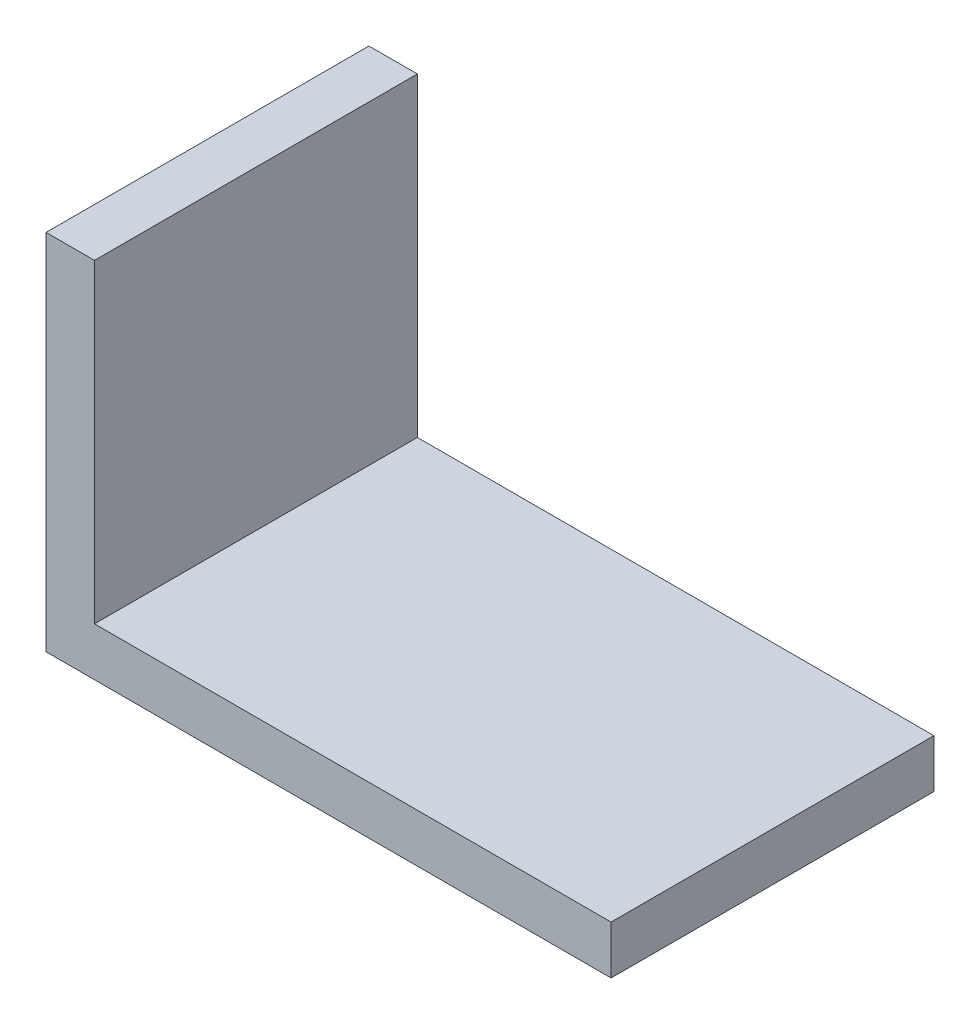
ISO-10303-21;
HEADER;
FILE_DESCRIPTION(('STEP AP214'),'2;1');
FILE_NAME('part.step','',(''),(''),'','','');
FILE_SCHEMA(('AUTOMOTIVE_DESIGN { 1 0 10303 214 1 1 1 1 }'));
ENDSEC;
DATA;
#1=APPLICATION_CONTEXT('core data for automotive mechanical design processes');
#2=APPLICATION_PROTOCOL_DEFINITION('international standard','automotive_design',2000,#1);
#3=PRODUCT_CONTEXT('',#1,'mechanical');
#4=PRODUCT('Part','Part','',(#3));
#5=PRODUCT_RELATED_PRODUCT_CATEGORY('part','',(#4));
#6=PRODUCT_DEFINITION_FORMATION('','',#4);
#7=PRODUCT_DEFINITION_CONTEXT('part definition',#1,'design');
#8=PRODUCT_DEFINITION('design','',#6,#7);
#9=PRODUCT_DEFINITION_SHAPE('','',#8);
#10=(LENGTH_UNIT() NAMED_UNIT(*) SI_UNIT(.MILLI.,.METRE.));
#11=(NAMED_UNIT(*) PLANE_ANGLE_UNIT() SI_UNIT($,.RADIAN.));
#12=(NAMED_UNIT(*) SI_UNIT($,.STERADIAN.) SOLID_ANGLE_UNIT());
#13=UNCERTAINTY_MEASURE_WITH_UNIT(LENGTH_MEASURE(1.E-05),#10,'distance_accuracy_value','');
#14=(GEOMETRIC_REPRESENTATION_CONTEXT(3) GLOBAL_UNCERTAINTY_ASSIGNED_CONTEXT((#13)) GLOBAL_UNIT_ASSIGNED_CONTEXT((#10,
#11,#12)) REPRESENTATION_CONTEXT('',''));
#15=CARTESIAN_POINT('',(0.,0.,0.));
#16=DIRECTION('',(0.,0.,1.));
#17=DIRECTION('',(1.,0.,0.));
#18=AXIS2_PLACEMENT_3D('',#15,#16,#17);
#19=CARTESIAN_POINT('',(0.,90.,40.));
#20=DIRECTION('',(1.,0.,0.));
#21=DIRECTION('',(0.,0.,-1.));
#22=AXIS2_PLACEMENT_3D('',#19,#20,#21);
#23=PLANE('',#22);
#24=DIRECTION('',(0.,-1.,0.));
#25=VECTOR('',#24,1.);
#26=CARTESIAN_POINT('',(0.,90.,-40.));
#27=LINE('',#26,#25);
#28=CARTESIAN_POINT('',(0.,90.,-40.));
#29=VERTEX_POINT('',#28);
#30=CARTESIAN_POINT('',(0.,0.,-40.));
#31=VERTEX_POINT('',#30);
#32=EDGE_CURVE('E125',#29,#31,#27,.T.);
#33=ORIENTED_EDGE('',*,*,#32,.T.);
#34=DIRECTION('',(0.,0.,-1.));
#35=VECTOR('',#34,1.);
#36=CARTESIAN_POINT('',(0.,0.,40.));
#37=LINE('',#36,#35);
#38=CARTESIAN_POINT('',(0.,0.,40.));
#39=VERTEX_POINT('',#38);
#40=EDGE_CURVE('E11',#39,#31,#37,.T.);
#41=ORIENTED_EDGE('',*,*,#40,.F.);
#42=DIRECTION('',(0.,-1.,0.));
#43=VECTOR('',#42,1.);
#44=CARTESIAN_POINT('',(0.,90.,40.));
#45=LINE('',#44,#43);
#46=CARTESIAN_POINT('',(0.,90.,40.));
#47=VERTEX_POINT('',#46);
#48=EDGE_CURVE('E135',#47,#39,#45,.T.);
#49=ORIENTED_EDGE('',*,*,#48,.F.);
#50=DIRECTION('',(0.,0.,-1.));
#51=VECTOR('',#50,1.);
#52=CARTESIAN_POINT('',(0.,90.,40.));
#53=LINE('',#52,#51);
#54=EDGE_CURVE('E121',#47,#29,#53,.T.);
#55=ORIENTED_EDGE('',*,*,#54,.T.);
#56=EDGE_LOOP('',(#33,#41,#49,#55));
#57=FACE_BOUND('',#56,.T.);
#58=ADVANCED_FACE('F41',(#57),#23,.F.);
#59=CARTESIAN_POINT('',(0.,0.,40.));
#60=DIRECTION('',(0.,1.,0.));
#61=DIRECTION('',(0.,0.,1.));
#62=AXIS2_PLACEMENT_3D('',#59,#60,#61);
#63=PLANE('',#62);
#64=DIRECTION('',(1.,0.,0.));
#65=VECTOR('',#64,1.);
#66=CARTESIAN_POINT('',(0.,0.,-40.));
#67=LINE('',#66,#65);
#68=CARTESIAN_POINT('',(140.,0.,-40.));
#69=VERTEX_POINT('',#68);
#70=EDGE_CURVE('E128',#31,#69,#67,.T.);
#71=ORIENTED_EDGE('',*,*,#70,.T.);
#72=DIRECTION('',(0.,0.,-1.));
#73=VECTOR('',#72,1.);
#74=CARTESIAN_POINT('',(140.,0.,40.));
#75=LINE('',#74,#73);
#76=CARTESIAN_POINT('',(140.,0.,40.));
#77=VERTEX_POINT('',#76);
#78=EDGE_CURVE('E49',#77,#69,#75,.T.);
#79=ORIENTED_EDGE('',*,*,#78,.F.);
#80=DIRECTION('',(1.,0.,0.));
#81=VECTOR('',#80,1.);
#82=CARTESIAN_POINT('',(0.,0.,40.));
#83=LINE('',#82,#81);
#84=EDGE_CURVE('E94',#39,#77,#83,.T.);
#85=ORIENTED_EDGE('',*,*,#84,.F.);
#86=ORIENTED_EDGE('',*,*,#40,.T.);
#87=EDGE_LOOP('',(#71,#79,#85,#86));
#88=FACE_BOUND('',#87,.T.);
#89=ADVANCED_FACE('F159',(#88),#63,.F.);
#90=CARTESIAN_POINT('',(140.,0.,40.));
#91=DIRECTION('',(-1.,0.,0.));
#92=DIRECTION('',(0.,0.,1.));
#93=AXIS2_PLACEMENT_3D('',#90,#91,#92);
#94=PLANE('',#93);
#95=DIRECTION('',(0.,1.,0.));
#96=VECTOR('',#95,1.);
#97=CARTESIAN_POINT('',(140.,0.,-40.));
#98=LINE('',#97,#96);
#99=CARTESIAN_POINT('',(140.,12.,-40.));
#100=VERTEX_POINT('',#99);
#101=EDGE_CURVE('E130',#69,#100,#98,.T.);
#102=ORIENTED_EDGE('',*,*,#101,.T.);
#103=DIRECTION('',(0.,0.,-1.));
#104=VECTOR('',#103,1.);
#105=CARTESIAN_POINT('',(140.,12.,40.));
#106=LINE('',#105,#104);
#107=CARTESIAN_POINT('',(140.,12.,40.));
#108=VERTEX_POINT('',#107);
#109=EDGE_CURVE('E116',#108,#100,#106,.T.);
#110=ORIENTED_EDGE('',*,*,#109,.F.);
#111=DIRECTION('',(0.,1.,0.));
#112=VECTOR('',#111,1.);
#113=CARTESIAN_POINT('',(140.,0.,40.));
#114=LINE('',#113,#112);
#115=EDGE_CURVE('E107',#77,#108,#114,.T.);
#116=ORIENTED_EDGE('',*,*,#115,.F.);
#117=ORIENTED_EDGE('',*,*,#78,.T.);
#118=EDGE_LOOP('',(#102,#110,#116,#117));
#119=FACE_BOUND('',#118,.T.);
#120=ADVANCED_FACE('F141',(#119),#94,.F.);
#121=CARTESIAN_POINT('',(140.,12.,40.));
#122=DIRECTION('',(0.,-1.,0.));
#123=DIRECTION('',(0.,0.,-1.));
#124=AXIS2_PLACEMENT_3D('',#121,#122,#123);
#125=PLANE('',#124);
#126=DIRECTION('',(-1.,0.,0.));
#127=VECTOR('',#126,1.);
#128=CARTESIAN_POINT('',(140.,12.,-40.));
#129=LINE('',#128,#127);
#130=CARTESIAN_POINT('',(12.,12.,-40.));
#131=VERTEX_POINT('',#130);
#132=EDGE_CURVE('E115',#100,#131,#129,.T.);
#133=ORIENTED_EDGE('',*,*,#132,.T.);
#134=DIRECTION('',(0.,0.,-1.));
#135=VECTOR('',#134,1.);
#136=CARTESIAN_POINT('',(12.,12.,40.));
#137=LINE('',#136,#135);
#138=CARTESIAN_POINT('',(12.,12.,40.));
#139=VERTEX_POINT('',#138);
#140=EDGE_CURVE('E112',#139,#131,#137,.T.);
#141=ORIENTED_EDGE('',*,*,#140,.F.);
#142=DIRECTION('',(-1.,0.,0.));
#143=VECTOR('',#142,1.);
#144=CARTESIAN_POINT('',(140.,12.,40.));
#145=LINE('',#144,#143);
#146=EDGE_CURVE('E101',#108,#139,#145,.T.);
#147=ORIENTED_EDGE('',*,*,#146,.F.);
#148=ORIENTED_EDGE('',*,*,#109,.T.);
#149=EDGE_LOOP('',(#133,#141,#147,#148));
#150=FACE_BOUND('',#149,.T.);
#151=ADVANCED_FACE('F113',(#150),#125,.F.);
#152=CARTESIAN_POINT('',(12.,12.,40.));
#153=DIRECTION('',(-1.,0.,0.));
#154=DIRECTION('',(0.,0.,1.));
#155=AXIS2_PLACEMENT_3D('',#152,#153,#154);
#156=PLANE('',#155);
#157=DIRECTION('',(0.,1.,0.));
#158=VECTOR('',#157,1.);
#159=CARTESIAN_POINT('',(12.,12.,-40.));
#160=LINE('',#159,#158);
#161=CARTESIAN_POINT('',(12.,90.,-40.));
#162=VERTEX_POINT('',#161);
#163=EDGE_CURVE('E80',#131,#162,#160,.T.);
#164=ORIENTED_EDGE('',*,*,#163,.T.);
#165=DIRECTION('',(0.,0.,-1.));
#166=VECTOR('',#165,1.);
#167=CARTESIAN_POINT('',(12.,90.,40.));
#168=LINE('',#167,#166);
#169=CARTESIAN_POINT('',(12.,90.,40.));
#170=VERTEX_POINT('',#169);
#171=EDGE_CURVE('E117',#170,#162,#168,.T.);
#172=ORIENTED_EDGE('',*,*,#171,.F.);
#173=DIRECTION('',(0.,1.,0.));
#174=VECTOR('',#173,1.);
#175=CARTESIAN_POINT('',(12.,12.,40.));
#176=LINE('',#175,#174);
#177=EDGE_CURVE('E105',#139,#170,#176,.T.);
#178=ORIENTED_EDGE('',*,*,#177,.F.);
#179=ORIENTED_EDGE('',*,*,#140,.T.);
#180=EDGE_LOOP('',(#164,#172,#178,#179));
#181=FACE_BOUND('',#180,.T.);
#182=ADVANCED_FACE('F119',(#181),#156,.F.);
#183=CARTESIAN_POINT('',(12.,90.,40.));
#184=DIRECTION('',(0.,-1.,0.));
#185=DIRECTION('',(0.,0.,-1.));
#186=AXIS2_PLACEMENT_3D('',#183,#184,#185);
#187=PLANE('',#186);
#188=DIRECTION('',(-1.,0.,0.));
#189=VECTOR('',#188,1.);
#190=CARTESIAN_POINT('',(12.,90.,-40.));
#191=LINE('',#190,#189);
#192=EDGE_CURVE('E86',#162,#29,#191,.T.);
#193=ORIENTED_EDGE('',*,*,#192,.T.);
#194=ORIENTED_EDGE('',*,*,#54,.F.);
#195=DIRECTION('',(-1.,0.,0.));
#196=VECTOR('',#195,1.);
#197=CARTESIAN_POINT('',(12.,90.,40.));
#198=LINE('',#197,#196);
#199=EDGE_CURVE('E57',#170,#47,#198,.T.);
#200=ORIENTED_EDGE('',*,*,#199,.F.);
#201=ORIENTED_EDGE('',*,*,#171,.T.);
#202=EDGE_LOOP('',(#193,#194,#200,#201));
#203=FACE_BOUND('',#202,.T.);
#204=ADVANCED_FACE('F148',(#203),#187,.F.);
#205=CARTESIAN_POINT('',(0.,0.,40.));
#206=DIRECTION('',(0.,0.,1.));
#207=DIRECTION('',(1.,0.,0.));
#208=AXIS2_PLACEMENT_3D('',#205,#206,#207);
#209=PLANE('',#208);
#210=ORIENTED_EDGE('',*,*,#48,.T.);
#211=ORIENTED_EDGE('',*,*,#84,.T.);
#212=ORIENTED_EDGE('',*,*,#115,.T.);
#213=ORIENTED_EDGE('',*,*,#146,.T.);
#214=ORIENTED_EDGE('',*,*,#177,.T.);
#215=ORIENTED_EDGE('',*,*,#199,.T.);
#216=EDGE_LOOP('',(#210,#211,#212,#213,#214,#215));
#217=FACE_BOUND('',#216,.T.);
#218=ADVANCED_FACE('F103',(#217),#209,.T.);
#219=CARTESIAN_POINT('',(0.,0.,-40.));
#220=DIRECTION('',(0.,0.,1.));
#221=DIRECTION('',(1.,0.,0.));
#222=AXIS2_PLACEMENT_3D('',#219,#220,#221);
#223=PLANE('',#222);
#224=ORIENTED_EDGE('',*,*,#32,.F.);
#225=ORIENTED_EDGE('',*,*,#192,.F.);
#226=ORIENTED_EDGE('',*,*,#163,.F.);
#227=ORIENTED_EDGE('',*,*,#132,.F.);
#228=ORIENTED_EDGE('',*,*,#101,.F.);
#229=ORIENTED_EDGE('',*,*,#70,.F.);
#230=EDGE_LOOP('',(#224,#225,#226,#227,#228,#229));
#231=FACE_BOUND('',#230,.T.);
#232=ADVANCED_FACE('F144',(#231),#223,.F.);
#233=CLOSED_SHELL('',(#58,#89,#120,#151,#182,#204,#218,#232));
#234=MANIFOLD_SOLID_BREP('B2',#233);
#235=ADVANCED_BREP_SHAPE_REPRESENTATION('',(#18,#234),#14);
#236=SHAPE_DEFINITION_REPRESENTATION(#9,#235);
ENDSEC;
END-ISO-10303-21;
